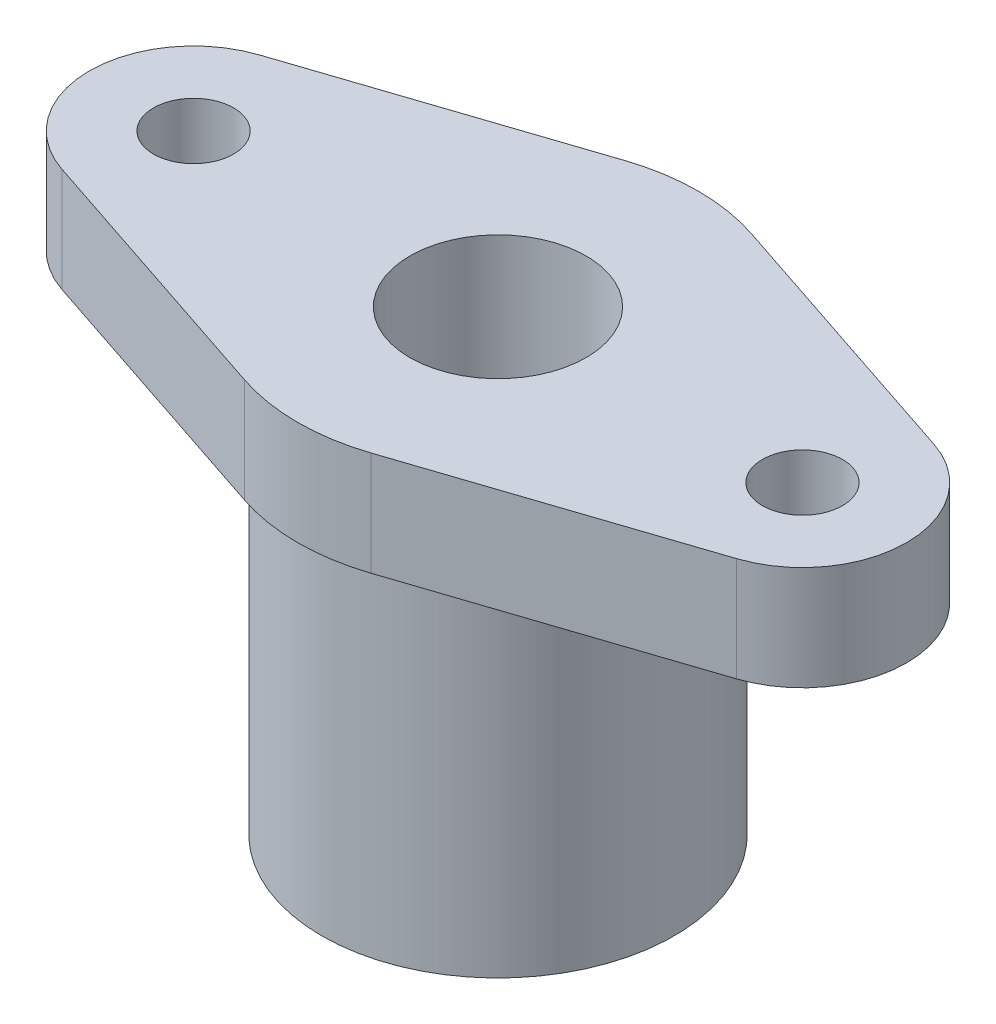
ISO-10303-21;
HEADER;
FILE_DESCRIPTION(('STEP AP214'),'2;1');
FILE_NAME('part.step','',(''),(''),'','','');
FILE_SCHEMA(('AUTOMOTIVE_DESIGN { 1 0 10303 214 1 1 1 1 }'));
ENDSEC;
DATA;
#1=APPLICATION_CONTEXT('core data for automotive mechanical design processes');
#2=APPLICATION_PROTOCOL_DEFINITION('international standard','automotive_design',2000,#1);
#3=PRODUCT_CONTEXT('',#1,'mechanical');
#4=PRODUCT('Part','Part','',(#3));
#5=PRODUCT_RELATED_PRODUCT_CATEGORY('part','',(#4));
#6=PRODUCT_DEFINITION_FORMATION('','',#4);
#7=PRODUCT_DEFINITION_CONTEXT('part definition',#1,'design');
#8=PRODUCT_DEFINITION('design','',#6,#7);
#9=PRODUCT_DEFINITION_SHAPE('','',#8);
#10=(LENGTH_UNIT() NAMED_UNIT(*) SI_UNIT(.MILLI.,.METRE.));
#11=(NAMED_UNIT(*) PLANE_ANGLE_UNIT() SI_UNIT($,.RADIAN.));
#12=(NAMED_UNIT(*) SI_UNIT($,.STERADIAN.) SOLID_ANGLE_UNIT());
#13=UNCERTAINTY_MEASURE_WITH_UNIT(LENGTH_MEASURE(1.E-05),#10,'distance_accuracy_value','');
#14=(GEOMETRIC_REPRESENTATION_CONTEXT(3) GLOBAL_UNCERTAINTY_ASSIGNED_CONTEXT((#13)) GLOBAL_UNIT_ASSIGNED_CONTEXT((#10,
#11,#12)) REPRESENTATION_CONTEXT('',''));
#15=CARTESIAN_POINT('',(0.,0.,0.));
#16=DIRECTION('',(0.,0.,1.));
#17=DIRECTION('',(1.,0.,0.));
#18=AXIS2_PLACEMENT_3D('',#15,#16,#17);
#19=CARTESIAN_POINT('',(-38.,-13.,0.));
#20=DIRECTION('',(0.,1.,0.));
#21=DIRECTION('',(0.,0.,1.));
#22=AXIS2_PLACEMENT_3D('',#19,#20,#21);
#23=CYLINDRICAL_SURFACE('',#22,13.);
#24=CARTESIAN_POINT('',(-38.,0.,0.));
#25=DIRECTION('',(0.,1.,0.));
#26=DIRECTION('',(0.,0.,1.));
#27=AXIS2_PLACEMENT_3D('',#24,#25,#26);
#28=CIRCLE('',#27,13.);
#29=CARTESIAN_POINT('',(-42.1052631578947,0.,-12.3347806792189));
#30=VERTEX_POINT('',#29);
#31=CARTESIAN_POINT('',(-42.1052631578947,0.,12.3347806792189));
#32=VERTEX_POINT('',#31);
#33=EDGE_CURVE('E131',#30,#32,#28,.T.);
#34=ORIENTED_EDGE('',*,*,#33,.F.);
#35=DIRECTION('',(0.,1.,0.));
#36=VECTOR('',#35,1.);
#37=CARTESIAN_POINT('',(-42.1052631578947,-13.,-12.3347806792189));
#38=LINE('',#37,#36);
#39=CARTESIAN_POINT('',(-42.1052631578947,-13.,-12.3347806792189));
#40=VERTEX_POINT('',#39);
#41=EDGE_CURVE('E41',#40,#30,#38,.T.);
#42=ORIENTED_EDGE('',*,*,#41,.F.);
#43=CARTESIAN_POINT('',(-38.,-13.,0.));
#44=DIRECTION('',(0.,1.,0.));
#45=DIRECTION('',(0.,0.,1.));
#46=AXIS2_PLACEMENT_3D('',#43,#44,#45);
#47=CIRCLE('',#46,13.);
#48=CARTESIAN_POINT('',(-42.1052631578947,-13.,12.3347806792189));
#49=VERTEX_POINT('',#48);
#50=EDGE_CURVE('E153',#40,#49,#47,.T.);
#51=ORIENTED_EDGE('',*,*,#50,.T.);
#52=DIRECTION('',(0.,1.,0.));
#53=VECTOR('',#52,1.);
#54=CARTESIAN_POINT('',(-42.1052631578947,-13.,12.3347806792189));
#55=LINE('',#54,#53);
#56=EDGE_CURVE('E89',#49,#32,#55,.T.);
#57=ORIENTED_EDGE('',*,*,#56,.T.);
#58=EDGE_LOOP('',(#34,#42,#51,#57));
#59=FACE_BOUND('',#58,.T.);
#60=ADVANCED_FACE('F33',(#59),#23,.T.);
#61=CARTESIAN_POINT('',(-42.1052631578947,-13.,-12.3347806792189));
#62=DIRECTION('',(-0.315789473684211,0.,-0.948829283016839));
#63=DIRECTION('',(-0.948829283016839,0.,0.315789473684211));
#64=AXIS2_PLACEMENT_3D('',#61,#62,#63);
#65=PLANE('',#64);
#66=DIRECTION('',(-0.948829283016839,0.,0.315789473684211));
#67=VECTOR('',#66,1.);
#68=CARTESIAN_POINT('',(-42.1052631578947,0.,-12.3347806792189));
#69=LINE('',#68,#67);
#70=CARTESIAN_POINT('',(-7.89473684210527,0.,-23.720732075421));
#71=VERTEX_POINT('',#70);
#72=EDGE_CURVE('E150',#71,#30,#69,.T.);
#73=ORIENTED_EDGE('',*,*,#72,.F.);
#74=DIRECTION('',(0.,1.,0.));
#75=VECTOR('',#74,1.);
#76=CARTESIAN_POINT('',(-7.89473684210527,-13.,-23.720732075421));
#77=LINE('',#76,#75);
#78=CARTESIAN_POINT('',(-7.89473684210527,-13.,-23.720732075421));
#79=VERTEX_POINT('',#78);
#80=EDGE_CURVE('E77',#79,#71,#77,.T.);
#81=ORIENTED_EDGE('',*,*,#80,.F.);
#82=DIRECTION('',(-0.948829283016839,0.,0.315789473684211));
#83=VECTOR('',#82,1.);
#84=CARTESIAN_POINT('',(-42.1052631578947,-13.,-12.3347806792189));
#85=LINE('',#84,#83);
#86=EDGE_CURVE('E121',#79,#40,#85,.T.);
#87=ORIENTED_EDGE('',*,*,#86,.T.);
#88=ORIENTED_EDGE('',*,*,#41,.T.);
#89=EDGE_LOOP('',(#73,#81,#87,#88));
#90=FACE_BOUND('',#89,.T.);
#91=ADVANCED_FACE('F166',(#90),#65,.T.);
#92=CARTESIAN_POINT('',(0.,-13.,0.));
#93=DIRECTION('',(0.,1.,0.));
#94=DIRECTION('',(0.,0.,1.));
#95=AXIS2_PLACEMENT_3D('',#92,#93,#94);
#96=CYLINDRICAL_SURFACE('',#95,25.);
#97=CARTESIAN_POINT('',(0.,0.,0.));
#98=DIRECTION('',(0.,1.,0.));
#99=DIRECTION('',(0.,0.,1.));
#100=AXIS2_PLACEMENT_3D('',#97,#98,#99);
#101=CIRCLE('',#100,25.);
#102=CARTESIAN_POINT('',(7.89473684210527,0.,-23.720732075421));
#103=VERTEX_POINT('',#102);
#104=EDGE_CURVE('E108',#103,#71,#101,.T.);
#105=ORIENTED_EDGE('',*,*,#104,.F.);
#106=DIRECTION('',(0.,1.,0.));
#107=VECTOR('',#106,1.);
#108=CARTESIAN_POINT('',(7.89473684210527,-13.,-23.720732075421));
#109=LINE('',#108,#107);
#110=CARTESIAN_POINT('',(7.89473684210527,-13.,-23.720732075421));
#111=VERTEX_POINT('',#110);
#112=EDGE_CURVE('E103',#111,#103,#109,.T.);
#113=ORIENTED_EDGE('',*,*,#112,.F.);
#114=CARTESIAN_POINT('',(0.,-13.,0.));
#115=DIRECTION('',(0.,1.,0.));
#116=DIRECTION('',(0.,0.,1.));
#117=AXIS2_PLACEMENT_3D('',#114,#115,#116);
#118=CIRCLE('',#117,25.);
#119=EDGE_CURVE('E106',#111,#79,#118,.T.);
#120=ORIENTED_EDGE('',*,*,#119,.T.);
#121=ORIENTED_EDGE('',*,*,#80,.T.);
#122=EDGE_LOOP('',(#105,#113,#120,#121));
#123=FACE_BOUND('',#122,.T.);
#124=ADVANCED_FACE('F105',(#123),#96,.T.);
#125=CARTESIAN_POINT('',(42.1052631578947,-13.,-12.3347806792189));
#126=DIRECTION('',(0.315789473684211,0.,-0.948829283016839));
#127=DIRECTION('',(-0.948829283016839,0.,-0.315789473684211));
#128=AXIS2_PLACEMENT_3D('',#125,#126,#127);
#129=PLANE('',#128);
#130=DIRECTION('',(-0.948829283016839,0.,-0.315789473684211));
#131=VECTOR('',#130,1.);
#132=CARTESIAN_POINT('',(42.1052631578947,0.,-12.3347806792189));
#133=LINE('',#132,#131);
#134=CARTESIAN_POINT('',(42.1052631578947,0.,-12.3347806792189));
#135=VERTEX_POINT('',#134);
#136=EDGE_CURVE('E147',#135,#103,#133,.T.);
#137=ORIENTED_EDGE('',*,*,#136,.F.);
#138=DIRECTION('',(0.,1.,0.));
#139=VECTOR('',#138,1.);
#140=CARTESIAN_POINT('',(42.1052631578947,-13.,-12.3347806792189));
#141=LINE('',#140,#139);
#142=CARTESIAN_POINT('',(42.1052631578947,-13.,-12.3347806792189));
#143=VERTEX_POINT('',#142);
#144=EDGE_CURVE('E113',#143,#135,#141,.T.);
#145=ORIENTED_EDGE('',*,*,#144,.F.);
#146=DIRECTION('',(-0.948829283016839,0.,-0.315789473684211));
#147=VECTOR('',#146,1.);
#148=CARTESIAN_POINT('',(42.1052631578947,-13.,-12.3347806792189));
#149=LINE('',#148,#147);
#150=EDGE_CURVE('E119',#143,#111,#149,.T.);
#151=ORIENTED_EDGE('',*,*,#150,.T.);
#152=ORIENTED_EDGE('',*,*,#112,.T.);
#153=EDGE_LOOP('',(#137,#145,#151,#152));
#154=FACE_BOUND('',#153,.T.);
#155=ADVANCED_FACE('F123',(#154),#129,.T.);
#156=CARTESIAN_POINT('',(38.,-13.,0.));
#157=DIRECTION('',(0.,1.,0.));
#158=DIRECTION('',(0.,0.,1.));
#159=AXIS2_PLACEMENT_3D('',#156,#157,#158);
#160=CYLINDRICAL_SURFACE('',#159,13.);
#161=CARTESIAN_POINT('',(38.,0.,0.));
#162=DIRECTION('',(0.,1.,0.));
#163=DIRECTION('',(0.,0.,-1.));
#164=AXIS2_PLACEMENT_3D('',#161,#162,#163);
#165=CIRCLE('',#164,13.);
#166=CARTESIAN_POINT('',(42.1052631578947,0.,12.3347806792189));
#167=VERTEX_POINT('',#166);
#168=EDGE_CURVE('E144',#167,#135,#165,.T.);
#169=ORIENTED_EDGE('',*,*,#168,.F.);
#170=DIRECTION('',(0.,1.,0.));
#171=VECTOR('',#170,1.);
#172=CARTESIAN_POINT('',(42.1052631578947,-13.,12.3347806792189));
#173=LINE('',#172,#171);
#174=CARTESIAN_POINT('',(42.1052631578947,-13.,12.3347806792189));
#175=VERTEX_POINT('',#174);
#176=EDGE_CURVE('E157',#175,#167,#173,.T.);
#177=ORIENTED_EDGE('',*,*,#176,.F.);
#178=CARTESIAN_POINT('',(38.,-13.,0.));
#179=DIRECTION('',(0.,1.,0.));
#180=DIRECTION('',(0.,0.,-1.));
#181=AXIS2_PLACEMENT_3D('',#178,#179,#180);
#182=CIRCLE('',#181,13.);
#183=EDGE_CURVE('E124',#175,#143,#182,.T.);
#184=ORIENTED_EDGE('',*,*,#183,.T.);
#185=ORIENTED_EDGE('',*,*,#144,.T.);
#186=EDGE_LOOP('',(#169,#177,#184,#185));
#187=FACE_BOUND('',#186,.T.);
#188=ADVANCED_FACE('F179',(#187),#160,.T.);
#189=CARTESIAN_POINT('',(42.1052631578947,-13.,12.3347806792189));
#190=DIRECTION('',(0.315789473684211,0.,0.948829283016839));
#191=DIRECTION('',(0.948829283016839,0.,-0.315789473684211));
#192=AXIS2_PLACEMENT_3D('',#189,#190,#191);
#193=PLANE('',#192);
#194=DIRECTION('',(0.948829283016839,0.,-0.315789473684211));
#195=VECTOR('',#194,1.);
#196=CARTESIAN_POINT('',(42.1052631578947,0.,12.3347806792189));
#197=LINE('',#196,#195);
#198=CARTESIAN_POINT('',(7.89473684210527,0.,23.720732075421));
#199=VERTEX_POINT('',#198);
#200=EDGE_CURVE('E141',#199,#167,#197,.T.);
#201=ORIENTED_EDGE('',*,*,#200,.F.);
#202=DIRECTION('',(0.,1.,0.));
#203=VECTOR('',#202,1.);
#204=CARTESIAN_POINT('',(7.89473684210527,-13.,23.720732075421));
#205=LINE('',#204,#203);
#206=CARTESIAN_POINT('',(7.89473684210527,-13.,23.720732075421));
#207=VERTEX_POINT('',#206);
#208=EDGE_CURVE('E159',#207,#199,#205,.T.);
#209=ORIENTED_EDGE('',*,*,#208,.F.);
#210=DIRECTION('',(0.948829283016839,0.,-0.315789473684211));
#211=VECTOR('',#210,1.);
#212=CARTESIAN_POINT('',(42.1052631578947,-13.,12.3347806792189));
#213=LINE('',#212,#211);
#214=EDGE_CURVE('E126',#207,#175,#213,.T.);
#215=ORIENTED_EDGE('',*,*,#214,.T.);
#216=ORIENTED_EDGE('',*,*,#176,.T.);
#217=EDGE_LOOP('',(#201,#209,#215,#216));
#218=FACE_BOUND('',#217,.T.);
#219=ADVANCED_FACE('F182',(#218),#193,.T.);
#220=CARTESIAN_POINT('',(0.,-13.,0.));
#221=DIRECTION('',(0.,1.,0.));
#222=DIRECTION('',(0.,0.,1.));
#223=AXIS2_PLACEMENT_3D('',#220,#221,#222);
#224=CYLINDRICAL_SURFACE('',#223,25.);
#225=CARTESIAN_POINT('',(0.,0.,0.));
#226=DIRECTION('',(0.,1.,0.));
#227=DIRECTION('',(0.,0.,1.));
#228=AXIS2_PLACEMENT_3D('',#225,#226,#227);
#229=CIRCLE('',#228,25.);
#230=CARTESIAN_POINT('',(-7.89473684210527,0.,23.720732075421));
#231=VERTEX_POINT('',#230);
#232=EDGE_CURVE('E138',#231,#199,#229,.T.);
#233=ORIENTED_EDGE('',*,*,#232,.F.);
#234=DIRECTION('',(0.,1.,0.));
#235=VECTOR('',#234,1.);
#236=CARTESIAN_POINT('',(-7.89473684210527,-13.,23.720732075421));
#237=LINE('',#236,#235);
#238=CARTESIAN_POINT('',(-7.89473684210527,-13.,23.720732075421));
#239=VERTEX_POINT('',#238);
#240=EDGE_CURVE('E161',#239,#231,#237,.T.);
#241=ORIENTED_EDGE('',*,*,#240,.F.);
#242=CARTESIAN_POINT('',(0.,-13.,0.));
#243=DIRECTION('',(0.,1.,0.));
#244=DIRECTION('',(0.,0.,1.));
#245=AXIS2_PLACEMENT_3D('',#242,#243,#244);
#246=CIRCLE('',#245,25.);
#247=EDGE_CURVE('E250',#239,#207,#246,.T.);
#248=ORIENTED_EDGE('',*,*,#247,.T.);
#249=ORIENTED_EDGE('',*,*,#208,.T.);
#250=EDGE_LOOP('',(#233,#241,#248,#249));
#251=FACE_BOUND('',#250,.T.);
#252=ADVANCED_FACE('F186',(#251),#224,.T.);
#253=CARTESIAN_POINT('',(-42.1052631578947,-13.,12.3347806792189));
#254=DIRECTION('',(-0.315789473684211,0.,0.948829283016839));
#255=DIRECTION('',(0.948829283016839,0.,0.315789473684211));
#256=AXIS2_PLACEMENT_3D('',#253,#254,#255);
#257=PLANE('',#256);
#258=DIRECTION('',(0.948829283016839,0.,0.315789473684211));
#259=VECTOR('',#258,1.);
#260=CARTESIAN_POINT('',(-42.1052631578947,0.,12.3347806792189));
#261=LINE('',#260,#259);
#262=EDGE_CURVE('E134',#32,#231,#261,.T.);
#263=ORIENTED_EDGE('',*,*,#262,.F.);
#264=ORIENTED_EDGE('',*,*,#56,.F.);
#265=DIRECTION('',(0.948829283016839,0.,0.315789473684211));
#266=VECTOR('',#265,1.);
#267=CARTESIAN_POINT('',(-42.1052631578947,-13.,12.3347806792189));
#268=LINE('',#267,#266);
#269=EDGE_CURVE('E248',#49,#239,#268,.T.);
#270=ORIENTED_EDGE('',*,*,#269,.T.);
#271=ORIENTED_EDGE('',*,*,#240,.T.);
#272=EDGE_LOOP('',(#263,#264,#270,#271));
#273=FACE_BOUND('',#272,.T.);
#274=ADVANCED_FACE('F162',(#273),#257,.T.);
#275=CARTESIAN_POINT('',(-38.,-13.,0.));
#276=DIRECTION('',(0.,1.,0.));
#277=DIRECTION('',(0.,0.,1.));
#278=AXIS2_PLACEMENT_3D('',#275,#276,#277);
#279=PLANE('',#278);
#280=CARTESIAN_POINT('',(0.,-13.,0.));
#281=DIRECTION('',(0.,1.,0.));
#282=DIRECTION('',(0.,0.,1.));
#283=AXIS2_PLACEMENT_3D('',#280,#281,#282);
#284=CIRCLE('',#283,22.);
#285=CARTESIAN_POINT('',(0.,-13.,22.));
#286=VERTEX_POINT('',#285);
#287=EDGE_CURVE('E11',#286,#286,#284,.F.);
#288=ORIENTED_EDGE('',*,*,#287,.F.);
#289=EDGE_LOOP('',(#288));
#290=FACE_BOUND('',#289,.T.);
#291=CARTESIAN_POINT('',(-38.,-13.,0.));
#292=DIRECTION('',(0.,1.,0.));
#293=DIRECTION('',(0.,0.,1.));
#294=AXIS2_PLACEMENT_3D('',#291,#292,#293);
#295=CIRCLE('',#294,5.);
#296=CARTESIAN_POINT('',(-38.,-13.,5.));
#297=VERTEX_POINT('',#296);
#298=EDGE_CURVE('E237',#297,#297,#295,.T.);
#299=ORIENTED_EDGE('',*,*,#298,.T.);
#300=EDGE_LOOP('',(#299));
#301=FACE_BOUND('',#300,.T.);
#302=CARTESIAN_POINT('',(38.,-13.,0.));
#303=DIRECTION('',(0.,1.,0.));
#304=DIRECTION('',(0.,0.,1.));
#305=AXIS2_PLACEMENT_3D('',#302,#303,#304);
#306=CIRCLE('',#305,5.);
#307=CARTESIAN_POINT('',(38.,-13.,4.99999999999999));
#308=VERTEX_POINT('',#307);
#309=EDGE_CURVE('E135',#308,#308,#306,.T.);
#310=ORIENTED_EDGE('',*,*,#309,.T.);
#311=EDGE_LOOP('',(#310));
#312=FACE_BOUND('',#311,.T.);
#313=ORIENTED_EDGE('',*,*,#50,.F.);
#314=ORIENTED_EDGE('',*,*,#86,.F.);
#315=ORIENTED_EDGE('',*,*,#119,.F.);
#316=ORIENTED_EDGE('',*,*,#150,.F.);
#317=ORIENTED_EDGE('',*,*,#183,.F.);
#318=ORIENTED_EDGE('',*,*,#214,.F.);
#319=ORIENTED_EDGE('',*,*,#247,.F.);
#320=ORIENTED_EDGE('',*,*,#269,.F.);
#321=EDGE_LOOP('',(#313,#314,#315,#316,#317,#318,#319,#320));
#322=FACE_BOUND('',#321,.T.);
#323=ADVANCED_FACE('F117',(#290,#301,#312,#322),#279,.F.);
#324=CARTESIAN_POINT('',(-38.,0.,0.));
#325=DIRECTION('',(0.,1.,0.));
#326=DIRECTION('',(0.,0.,1.));
#327=AXIS2_PLACEMENT_3D('',#324,#325,#326);
#328=PLANE('',#327);
#329=CARTESIAN_POINT('',(0.,0.,0.));
#330=DIRECTION('',(0.,1.,0.));
#331=DIRECTION('',(0.,0.,1.));
#332=AXIS2_PLACEMENT_3D('',#329,#330,#331);
#333=CIRCLE('',#332,11.);
#334=CARTESIAN_POINT('',(0.,0.,11.));
#335=VERTEX_POINT('',#334);
#336=EDGE_CURVE('E230',#335,#335,#333,.T.);
#337=ORIENTED_EDGE('',*,*,#336,.F.);
#338=EDGE_LOOP('',(#337));
#339=FACE_BOUND('',#338,.T.);
#340=CARTESIAN_POINT('',(-38.,0.,0.));
#341=DIRECTION('',(0.,1.,0.));
#342=DIRECTION('',(0.,0.,1.));
#343=AXIS2_PLACEMENT_3D('',#340,#341,#342);
#344=CIRCLE('',#343,5.);
#345=CARTESIAN_POINT('',(-38.,0.,5.));
#346=VERTEX_POINT('',#345);
#347=EDGE_CURVE('E233',#346,#346,#344,.T.);
#348=ORIENTED_EDGE('',*,*,#347,.F.);
#349=EDGE_LOOP('',(#348));
#350=FACE_BOUND('',#349,.T.);
#351=CARTESIAN_POINT('',(38.,0.,0.));
#352=DIRECTION('',(0.,1.,0.));
#353=DIRECTION('',(0.,0.,1.));
#354=AXIS2_PLACEMENT_3D('',#351,#352,#353);
#355=CIRCLE('',#354,5.);
#356=CARTESIAN_POINT('',(38.,0.,4.99999999999999));
#357=VERTEX_POINT('',#356);
#358=EDGE_CURVE('E240',#357,#357,#355,.T.);
#359=ORIENTED_EDGE('',*,*,#358,.F.);
#360=EDGE_LOOP('',(#359));
#361=FACE_BOUND('',#360,.T.);
#362=ORIENTED_EDGE('',*,*,#33,.T.);
#363=ORIENTED_EDGE('',*,*,#262,.T.);
#364=ORIENTED_EDGE('',*,*,#232,.T.);
#365=ORIENTED_EDGE('',*,*,#200,.T.);
#366=ORIENTED_EDGE('',*,*,#168,.T.);
#367=ORIENTED_EDGE('',*,*,#136,.T.);
#368=ORIENTED_EDGE('',*,*,#104,.T.);
#369=ORIENTED_EDGE('',*,*,#72,.T.);
#370=EDGE_LOOP('',(#362,#363,#364,#365,#366,#367,#368,#369));
#371=FACE_BOUND('',#370,.T.);
#372=ADVANCED_FACE('F165',(#339,#350,#361,#371),#328,.T.);
#373=CARTESIAN_POINT('',(38.,-13.,0.));
#374=DIRECTION('',(0.,1.,0.));
#375=DIRECTION('',(0.,0.,1.));
#376=AXIS2_PLACEMENT_3D('',#373,#374,#375);
#377=CYLINDRICAL_SURFACE('',#376,5.);
#378=CARTESIAN_POINT('',(38.,-13.,4.99999999999999));
#379=CARTESIAN_POINT('',(38.,-12.8645833333333,4.99999999999999));
#380=CARTESIAN_POINT('',(38.,-12.7291666666667,4.99999999999999));
#381=CARTESIAN_POINT('',(38.,-12.4583333333333,4.99999999999999));
#382=CARTESIAN_POINT('',(38.,-12.3229166666667,4.99999999999999));
#383=CARTESIAN_POINT('',(38.,-12.0520833333333,4.99999999999999));
#384=CARTESIAN_POINT('',(38.,-11.9166666666667,4.99999999999999));
#385=CARTESIAN_POINT('',(38.,-11.6458333333333,4.99999999999999));
#386=CARTESIAN_POINT('',(38.,-11.5104166666667,4.99999999999999));
#387=CARTESIAN_POINT('',(38.,-11.2395833333333,4.99999999999999));
#388=CARTESIAN_POINT('',(38.,-11.1041666666667,4.99999999999999));
#389=CARTESIAN_POINT('',(38.,-10.8333333333333,4.99999999999999));
#390=CARTESIAN_POINT('',(38.,-10.6979166666667,4.99999999999999));
#391=CARTESIAN_POINT('',(38.,-10.4270833333333,4.99999999999999));
#392=CARTESIAN_POINT('',(38.,-10.2916666666667,4.99999999999999));
#393=CARTESIAN_POINT('',(38.,-10.0208333333333,4.99999999999999));
#394=CARTESIAN_POINT('',(38.,-9.88541666666667,4.99999999999999));
#395=CARTESIAN_POINT('',(38.,-9.61458333333333,4.99999999999999));
#396=CARTESIAN_POINT('',(38.,-9.47916666666667,4.99999999999999));
#397=CARTESIAN_POINT('',(38.,-9.20833333333333,4.99999999999999));
#398=CARTESIAN_POINT('',(38.,-9.07291666666667,4.99999999999999));
#399=CARTESIAN_POINT('',(38.,-8.80208333333333,4.99999999999999));
#400=CARTESIAN_POINT('',(38.,-8.66666666666667,4.99999999999999));
#401=CARTESIAN_POINT('',(38.,-8.39583333333333,4.99999999999999));
#402=CARTESIAN_POINT('',(38.,-8.26041666666667,4.99999999999999));
#403=CARTESIAN_POINT('',(38.,-7.98958333333333,4.99999999999999));
#404=CARTESIAN_POINT('',(38.,-7.85416666666667,4.99999999999999));
#405=CARTESIAN_POINT('',(38.,-7.58333333333333,4.99999999999999));
#406=CARTESIAN_POINT('',(38.,-7.44791666666667,4.99999999999999));
#407=CARTESIAN_POINT('',(38.,-7.17708333333333,4.99999999999999));
#408=CARTESIAN_POINT('',(38.,-7.04166666666667,4.99999999999999));
#409=CARTESIAN_POINT('',(38.,-6.77083333333333,4.99999999999999));
#410=CARTESIAN_POINT('',(38.,-6.63541666666667,4.99999999999999));
#411=CARTESIAN_POINT('',(38.,-6.36458333333333,4.99999999999999));
#412=CARTESIAN_POINT('',(38.,-6.22916666666667,4.99999999999999));
#413=CARTESIAN_POINT('',(38.,-5.95833333333333,4.99999999999999));
#414=CARTESIAN_POINT('',(38.,-5.82291666666667,4.99999999999999));
#415=CARTESIAN_POINT('',(38.,-5.55208333333333,4.99999999999999));
#416=CARTESIAN_POINT('',(38.,-5.41666666666667,4.99999999999999));
#417=CARTESIAN_POINT('',(38.,-5.14583333333333,4.99999999999999));
#418=CARTESIAN_POINT('',(38.,-5.01041666666667,4.99999999999999));
#419=CARTESIAN_POINT('',(38.,-4.73958333333333,4.99999999999999));
#420=CARTESIAN_POINT('',(38.,-4.60416666666667,4.99999999999999));
#421=CARTESIAN_POINT('',(38.,-4.33333333333333,4.99999999999999));
#422=CARTESIAN_POINT('',(38.,-4.19791666666667,4.99999999999999));
#423=CARTESIAN_POINT('',(38.,-3.92708333333333,4.99999999999999));
#424=CARTESIAN_POINT('',(38.,-3.79166666666667,4.99999999999999));
#425=CARTESIAN_POINT('',(38.,-3.52083333333333,4.99999999999999));
#426=CARTESIAN_POINT('',(38.,-3.38541666666667,4.99999999999999));
#427=CARTESIAN_POINT('',(38.,-3.11458333333333,4.99999999999999));
#428=CARTESIAN_POINT('',(38.,-2.97916666666667,4.99999999999999));
#429=CARTESIAN_POINT('',(38.,-2.70833333333333,4.99999999999999));
#430=CARTESIAN_POINT('',(38.,-2.57291666666667,4.99999999999999));
#431=CARTESIAN_POINT('',(38.,-2.30208333333333,4.99999999999999));
#432=CARTESIAN_POINT('',(38.,-2.16666666666667,4.99999999999999));
#433=CARTESIAN_POINT('',(38.,-1.89583333333333,4.99999999999999));
#434=CARTESIAN_POINT('',(38.,-1.76041666666667,4.99999999999999));
#435=CARTESIAN_POINT('',(38.,-1.48958333333333,4.99999999999999));
#436=CARTESIAN_POINT('',(38.,-1.35416666666667,4.99999999999999));
#437=CARTESIAN_POINT('',(38.,-1.08333333333333,4.99999999999999));
#438=CARTESIAN_POINT('',(38.,-0.947916666666667,4.99999999999999));
#439=CARTESIAN_POINT('',(38.,-0.677083333333334,4.99999999999999));
#440=CARTESIAN_POINT('',(38.,-0.541666666666667,4.99999999999999));
#441=CARTESIAN_POINT('',(38.,-0.270833333333334,4.99999999999999));
#442=CARTESIAN_POINT('',(38.,-0.135416666666667,4.99999999999999));
#443=CARTESIAN_POINT('',(38.,0.,4.99999999999999));
#444=B_SPLINE_CURVE_WITH_KNOTS('',3,(#378,#379,#380,#381,#382,#383,#384,#385,#386,#387,#388,
#389,#390,#391,#392,#393,#394,#395,#396,#397,#398,#399,#400,#401,#402,#403,#404,#405,#406,#407,
#408,#409,#410,#411,#412,#413,#414,#415,#416,#417,#418,#419,#420,#421,#422,#423,#424,#425,#426,
#427,#428,#429,#430,#431,#432,#433,#434,#435,#436,#437,#438,#439,#440,#441,#442,#443),
.UNSPECIFIED.,.F.,.F.,(4,2,2,2,2,2,2,2,2,2,2,2,2,2,2,2,2,2,2,2,2,2,2,2,2,2,2,2,2,2,2,2,4),(0.,
0.406249999999999,0.812499999999999,1.21875,1.625,2.03125,2.4375,2.84375,3.25,3.65625,4.0625,
4.46875,4.875,5.28125,5.6875,6.09375,6.5,6.90625,7.3125,7.71875,8.125,8.53125,8.9375,9.34375,
9.75,10.15625,10.5625,10.96875,11.375,11.78125,12.1875,12.59375,13.),.UNSPECIFIED.);
#445=EDGE_CURVE('BSEAM198',#308,#357,#444,.T.);
#446=ORIENTED_EDGE('',*,*,#309,.F.);
#447=ORIENTED_EDGE('',*,*,#358,.T.);
#448=ORIENTED_EDGE('',*,*,#445,.T.);
#449=ORIENTED_EDGE('',*,*,#445,.F.);
#450=EDGE_LOOP('',(#446,#448,#447,#449));
#451=FACE_BOUND('',#450,.T.);
#452=ADVANCED_FACE('F198',(#451),#377,.F.);
#453=CARTESIAN_POINT('',(-38.,-13.,0.));
#454=DIRECTION('',(0.,1.,0.));
#455=DIRECTION('',(0.,0.,1.));
#456=AXIS2_PLACEMENT_3D('',#453,#454,#455);
#457=CYLINDRICAL_SURFACE('',#456,5.);
#458=CARTESIAN_POINT('',(-38.,-13.,5.));
#459=CARTESIAN_POINT('',(-38.,-12.8645833333333,5.));
#460=CARTESIAN_POINT('',(-38.,-12.7291666666667,5.));
#461=CARTESIAN_POINT('',(-38.,-12.4583333333333,5.));
#462=CARTESIAN_POINT('',(-38.,-12.3229166666667,5.));
#463=CARTESIAN_POINT('',(-38.,-12.0520833333333,5.));
#464=CARTESIAN_POINT('',(-38.,-11.9166666666667,5.));
#465=CARTESIAN_POINT('',(-38.,-11.6458333333333,5.));
#466=CARTESIAN_POINT('',(-38.,-11.5104166666667,5.));
#467=CARTESIAN_POINT('',(-38.,-11.2395833333333,5.));
#468=CARTESIAN_POINT('',(-38.,-11.1041666666667,5.));
#469=CARTESIAN_POINT('',(-38.,-10.8333333333333,5.));
#470=CARTESIAN_POINT('',(-38.,-10.6979166666667,5.));
#471=CARTESIAN_POINT('',(-38.,-10.4270833333333,5.));
#472=CARTESIAN_POINT('',(-38.,-10.2916666666667,5.));
#473=CARTESIAN_POINT('',(-38.,-10.0208333333333,5.));
#474=CARTESIAN_POINT('',(-38.,-9.88541666666667,5.));
#475=CARTESIAN_POINT('',(-38.,-9.61458333333333,5.));
#476=CARTESIAN_POINT('',(-38.,-9.47916666666667,5.));
#477=CARTESIAN_POINT('',(-38.,-9.20833333333333,5.));
#478=CARTESIAN_POINT('',(-38.,-9.07291666666667,5.));
#479=CARTESIAN_POINT('',(-38.,-8.80208333333333,5.));
#480=CARTESIAN_POINT('',(-38.,-8.66666666666667,5.));
#481=CARTESIAN_POINT('',(-38.,-8.39583333333333,5.));
#482=CARTESIAN_POINT('',(-38.,-8.26041666666667,5.));
#483=CARTESIAN_POINT('',(-38.,-7.98958333333333,5.));
#484=CARTESIAN_POINT('',(-38.,-7.85416666666667,5.));
#485=CARTESIAN_POINT('',(-38.,-7.58333333333333,5.));
#486=CARTESIAN_POINT('',(-38.,-7.44791666666667,5.));
#487=CARTESIAN_POINT('',(-38.,-7.17708333333333,5.));
#488=CARTESIAN_POINT('',(-38.,-7.04166666666667,5.));
#489=CARTESIAN_POINT('',(-38.,-6.77083333333333,5.));
#490=CARTESIAN_POINT('',(-38.,-6.63541666666667,5.));
#491=CARTESIAN_POINT('',(-38.,-6.36458333333333,5.));
#492=CARTESIAN_POINT('',(-38.,-6.22916666666667,5.));
#493=CARTESIAN_POINT('',(-38.,-5.95833333333333,5.));
#494=CARTESIAN_POINT('',(-38.,-5.82291666666667,5.));
#495=CARTESIAN_POINT('',(-38.,-5.55208333333333,5.));
#496=CARTESIAN_POINT('',(-38.,-5.41666666666667,5.));
#497=CARTESIAN_POINT('',(-38.,-5.14583333333333,5.));
#498=CARTESIAN_POINT('',(-38.,-5.01041666666667,5.));
#499=CARTESIAN_POINT('',(-38.,-4.73958333333333,5.));
#500=CARTESIAN_POINT('',(-38.,-4.60416666666667,5.));
#501=CARTESIAN_POINT('',(-38.,-4.33333333333333,5.));
#502=CARTESIAN_POINT('',(-38.,-4.19791666666667,5.));
#503=CARTESIAN_POINT('',(-38.,-3.92708333333333,5.));
#504=CARTESIAN_POINT('',(-38.,-3.79166666666667,5.));
#505=CARTESIAN_POINT('',(-38.,-3.52083333333333,5.));
#506=CARTESIAN_POINT('',(-38.,-3.38541666666667,5.));
#507=CARTESIAN_POINT('',(-38.,-3.11458333333333,5.));
#508=CARTESIAN_POINT('',(-38.,-2.97916666666667,5.));
#509=CARTESIAN_POINT('',(-38.,-2.70833333333333,5.));
#510=CARTESIAN_POINT('',(-38.,-2.57291666666667,5.));
#511=CARTESIAN_POINT('',(-38.,-2.30208333333333,5.));
#512=CARTESIAN_POINT('',(-38.,-2.16666666666667,5.));
#513=CARTESIAN_POINT('',(-38.,-1.89583333333333,5.));
#514=CARTESIAN_POINT('',(-38.,-1.76041666666667,5.));
#515=CARTESIAN_POINT('',(-38.,-1.48958333333333,5.));
#516=CARTESIAN_POINT('',(-38.,-1.35416666666667,5.));
#517=CARTESIAN_POINT('',(-38.,-1.08333333333333,5.));
#518=CARTESIAN_POINT('',(-38.,-0.947916666666667,5.));
#519=CARTESIAN_POINT('',(-38.,-0.677083333333334,5.));
#520=CARTESIAN_POINT('',(-38.,-0.541666666666667,5.));
#521=CARTESIAN_POINT('',(-38.,-0.270833333333334,5.));
#522=CARTESIAN_POINT('',(-38.,-0.135416666666667,5.));
#523=CARTESIAN_POINT('',(-38.,0.,5.));
#524=B_SPLINE_CURVE_WITH_KNOTS('',3,(#458,#459,#460,#461,#462,#463,#464,#465,#466,#467,#468,
#469,#470,#471,#472,#473,#474,#475,#476,#477,#478,#479,#480,#481,#482,#483,#484,#485,#486,#487,
#488,#489,#490,#491,#492,#493,#494,#495,#496,#497,#498,#499,#500,#501,#502,#503,#504,#505,#506,
#507,#508,#509,#510,#511,#512,#513,#514,#515,#516,#517,#518,#519,#520,#521,#522,#523),
.UNSPECIFIED.,.F.,.F.,(4,2,2,2,2,2,2,2,2,2,2,2,2,2,2,2,2,2,2,2,2,2,2,2,2,2,2,2,2,2,2,2,4),(0.,
0.406249999999999,0.812499999999999,1.21875,1.625,2.03125,2.4375,2.84375,3.25,3.65625,4.0625,
4.46875,4.875,5.28125,5.6875,6.09375,6.5,6.90625,7.3125,7.71875,8.125,8.53125,8.9375,9.34375,
9.75,10.15625,10.5625,10.96875,11.375,11.78125,12.1875,12.59375,13.),.UNSPECIFIED.);
#525=EDGE_CURVE('BSEAM205',#297,#346,#524,.T.);
#526=ORIENTED_EDGE('',*,*,#298,.F.);
#527=ORIENTED_EDGE('',*,*,#347,.T.);
#528=ORIENTED_EDGE('',*,*,#525,.T.);
#529=ORIENTED_EDGE('',*,*,#525,.F.);
#530=EDGE_LOOP('',(#526,#528,#527,#529));
#531=FACE_BOUND('',#530,.T.);
#532=ADVANCED_FACE('F205',(#531),#457,.F.);
#533=CARTESIAN_POINT('',(0.,-57.,0.));
#534=DIRECTION('',(0.,1.,0.));
#535=DIRECTION('',(0.,0.,1.));
#536=AXIS2_PLACEMENT_3D('',#533,#534,#535);
#537=CYLINDRICAL_SURFACE('',#536,22.);
#538=CARTESIAN_POINT('',(0.,-57.,0.));
#539=DIRECTION('',(0.,1.,0.));
#540=DIRECTION('',(0.,0.,1.));
#541=AXIS2_PLACEMENT_3D('',#538,#539,#540);
#542=CIRCLE('',#541,22.);
#543=CARTESIAN_POINT('',(0.,-57.,22.));
#544=VERTEX_POINT('',#543);
#545=EDGE_CURVE('E226',#544,#544,#542,.T.);
#546=ORIENTED_EDGE('',*,*,#545,.T.);
#547=EDGE_LOOP('',(#546));
#548=FACE_BOUND('',#547,.T.);
#549=ORIENTED_EDGE('',*,*,#287,.T.);
#550=EDGE_LOOP('',(#549));
#551=FACE_BOUND('',#550,.T.);
#552=ADVANCED_FACE('F209',(#548,#551),#537,.T.);
#553=CARTESIAN_POINT('',(0.,0.,0.));
#554=DIRECTION('',(0.,1.,0.));
#555=DIRECTION('',(0.,0.,1.));
#556=AXIS2_PLACEMENT_3D('',#553,#554,#555);
#557=CYLINDRICAL_SURFACE('',#556,11.);
#558=CARTESIAN_POINT('',(0.,-50.6491470389142,0.));
#559=DIRECTION('',(0.,1.,0.));
#560=DIRECTION('',(0.,0.,1.));
#561=AXIS2_PLACEMENT_3D('',#558,#559,#560);
#562=CIRCLE('',#561,11.);
#563=CARTESIAN_POINT('',(0.,-50.6491470389142,11.));
#564=VERTEX_POINT('',#563);
#565=EDGE_CURVE('E229',#564,#564,#562,.T.);
#566=ORIENTED_EDGE('',*,*,#565,.F.);
#567=EDGE_LOOP('',(#566));
#568=FACE_BOUND('',#567,.T.);
#569=ORIENTED_EDGE('',*,*,#336,.T.);
#570=EDGE_LOOP('',(#569));
#571=FACE_BOUND('',#570,.T.);
#572=ADVANCED_FACE('F213',(#568,#571),#557,.F.);
#573=CARTESIAN_POINT('',(0.,-50.6491470389142,0.));
#574=DIRECTION('',(0.,-1.,0.));
#575=DIRECTION('',(0.,0.,-1.));
#576=AXIS2_PLACEMENT_3D('',#573,#574,#575);
#577=CONICAL_SURFACE('',#576,11.,1.0471975511966);
#578=ORIENTED_EDGE('',*,*,#545,.F.);
#579=EDGE_LOOP('',(#578));
#580=FACE_BOUND('',#579,.T.);
#581=ORIENTED_EDGE('',*,*,#565,.T.);
#582=EDGE_LOOP('',(#581));
#583=FACE_BOUND('',#582,.T.);
#584=ADVANCED_FACE('F217',(#580,#583),#577,.F.);
#585=CLOSED_SHELL('',(#60,#91,#124,#155,#188,#219,#252,#274,#323,#372,#452,#532,#552,#572,#584));
#586=MANIFOLD_SOLID_BREP('B2',#585);
#587=ADVANCED_BREP_SHAPE_REPRESENTATION('',(#18,#586),#14);
#588=SHAPE_DEFINITION_REPRESENTATION(#9,#587);
ENDSEC;
END-ISO-10303-21;
